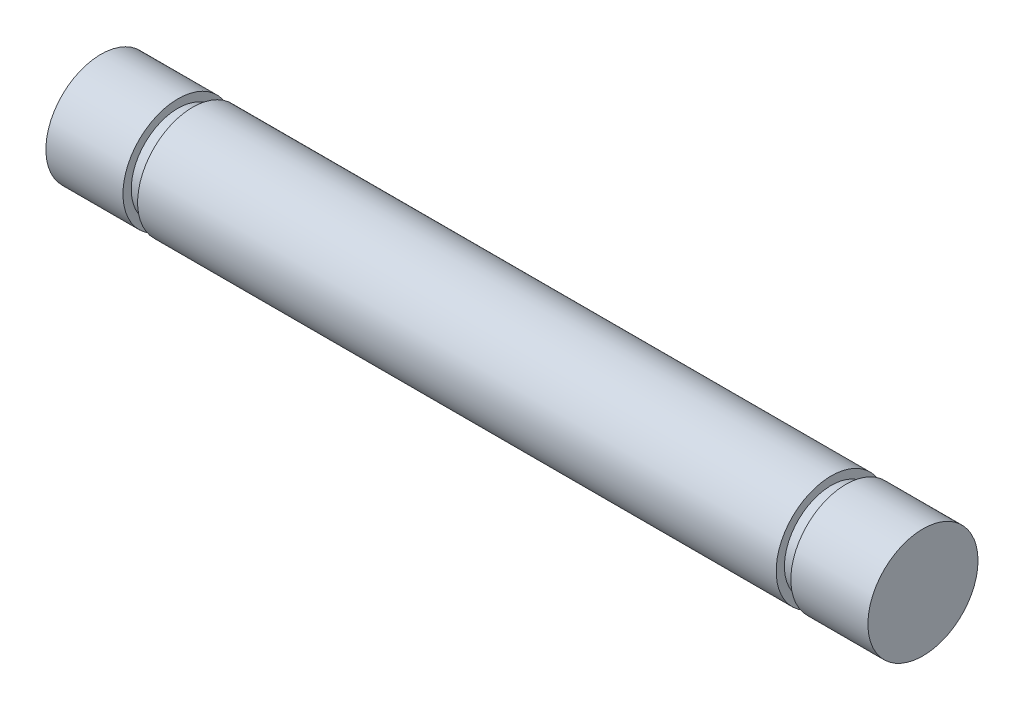
ISO-10303-21;
HEADER;
FILE_DESCRIPTION(('STEP AP214'),'2;1');
FILE_NAME('part.step','',(''),(''),'','','');
FILE_SCHEMA(('AUTOMOTIVE_DESIGN { 1 0 10303 214 1 1 1 1 }'));
ENDSEC;
DATA;
#1=APPLICATION_CONTEXT('core data for automotive mechanical design processes');
#2=APPLICATION_PROTOCOL_DEFINITION('international standard','automotive_design',2000,#1);
#3=PRODUCT_CONTEXT('',#1,'mechanical');
#4=PRODUCT('Part','Part','',(#3));
#5=PRODUCT_RELATED_PRODUCT_CATEGORY('part','',(#4));
#6=PRODUCT_DEFINITION_FORMATION('','',#4);
#7=PRODUCT_DEFINITION_CONTEXT('part definition',#1,'design');
#8=PRODUCT_DEFINITION('design','',#6,#7);
#9=PRODUCT_DEFINITION_SHAPE('','',#8);
#10=(LENGTH_UNIT() NAMED_UNIT(*) SI_UNIT(.MILLI.,.METRE.));
#11=(NAMED_UNIT(*) PLANE_ANGLE_UNIT() SI_UNIT($,.RADIAN.));
#12=(NAMED_UNIT(*) SI_UNIT($,.STERADIAN.) SOLID_ANGLE_UNIT());
#13=UNCERTAINTY_MEASURE_WITH_UNIT(LENGTH_MEASURE(1.E-05),#10,'distance_accuracy_value','');
#14=(GEOMETRIC_REPRESENTATION_CONTEXT(3) GLOBAL_UNCERTAINTY_ASSIGNED_CONTEXT((#13)) GLOBAL_UNIT_ASSIGNED_CONTEXT((#10,
#11,#12)) REPRESENTATION_CONTEXT('',''));
#15=CARTESIAN_POINT('',(0.,0.,0.));
#16=DIRECTION('',(0.,0.,1.));
#17=DIRECTION('',(1.,0.,0.));
#18=AXIS2_PLACEMENT_3D('',#15,#16,#17);
#19=CARTESIAN_POINT('',(22.4,0.,3.));
#20=DIRECTION('',(-1.,0.,0.));
#21=DIRECTION('',(0.,0.,1.));
#22=AXIS2_PLACEMENT_3D('',#19,#20,#21);
#23=PLANE('',#22);
#24=CARTESIAN_POINT('',(22.4,0.,0.));
#25=DIRECTION('',(1.,0.,0.));
#26=DIRECTION('',(0.,0.,-1.));
#27=AXIS2_PLACEMENT_3D('',#24,#25,#26);
#28=CIRCLE('',#27,3.);
#29=CARTESIAN_POINT('',(22.4,0.,-3.));
#30=VERTEX_POINT('',#29);
#31=EDGE_CURVE('E75',#30,#30,#28,.T.);
#32=ORIENTED_EDGE('',*,*,#31,.T.);
#33=EDGE_LOOP('',(#32));
#34=FACE_BOUND('',#33,.T.);
#35=ADVANCED_FACE('F41',(#34),#23,.F.);
#36=CARTESIAN_POINT('',(-22.4,0.,3.));
#37=DIRECTION('',(1.,0.,0.));
#38=DIRECTION('',(0.,0.,-1.));
#39=AXIS2_PLACEMENT_3D('',#36,#37,#38);
#40=PLANE('',#39);
#41=CARTESIAN_POINT('',(-22.4,0.,0.));
#42=DIRECTION('',(1.,0.,0.));
#43=DIRECTION('',(0.,0.,-1.));
#44=AXIS2_PLACEMENT_3D('',#41,#42,#43);
#45=CIRCLE('',#44,3.);
#46=CARTESIAN_POINT('',(-22.4,0.,-3.));
#47=VERTEX_POINT('',#46);
#48=EDGE_CURVE('E10',#47,#47,#45,.T.);
#49=ORIENTED_EDGE('',*,*,#48,.F.);
#50=EDGE_LOOP('',(#49));
#51=FACE_BOUND('',#50,.T.);
#52=ADVANCED_FACE('F129',(#51),#40,.F.);
#53=CARTESIAN_POINT('',(22.4,0.,0.));
#54=DIRECTION('',(1.,0.,0.));
#55=DIRECTION('',(0.,0.,-1.));
#56=AXIS2_PLACEMENT_3D('',#53,#54,#55);
#57=CYLINDRICAL_SURFACE('',#56,3.);
#58=CARTESIAN_POINT('',(-18.2,0.,0.));
#59=DIRECTION('',(1.,0.,0.));
#60=DIRECTION('',(0.,0.,-1.));
#61=AXIS2_PLACEMENT_3D('',#58,#59,#60);
#62=CIRCLE('',#61,3.);
#63=CARTESIAN_POINT('',(-18.2,0.,-3.));
#64=VERTEX_POINT('',#63);
#65=EDGE_CURVE('E47',#64,#64,#62,.T.);
#66=ORIENTED_EDGE('',*,*,#65,.F.);
#67=EDGE_LOOP('',(#66));
#68=FACE_BOUND('',#67,.T.);
#69=ORIENTED_EDGE('',*,*,#48,.T.);
#70=EDGE_LOOP('',(#69));
#71=FACE_BOUND('',#70,.T.);
#72=ADVANCED_FACE('F124',(#68,#71),#57,.T.);
#73=CARTESIAN_POINT('',(-18.2,0.,2.55));
#74=DIRECTION('',(-1.,0.,0.));
#75=DIRECTION('',(0.,0.,1.));
#76=AXIS2_PLACEMENT_3D('',#73,#74,#75);
#77=PLANE('',#76);
#78=CARTESIAN_POINT('',(-18.2,0.,0.));
#79=DIRECTION('',(1.,0.,0.));
#80=DIRECTION('',(0.,0.,-1.));
#81=AXIS2_PLACEMENT_3D('',#78,#79,#80);
#82=CIRCLE('',#81,2.55);
#83=CARTESIAN_POINT('',(-18.2,0.,-2.55));
#84=VERTEX_POINT('',#83);
#85=EDGE_CURVE('E51',#84,#84,#82,.T.);
#86=ORIENTED_EDGE('',*,*,#85,.F.);
#87=EDGE_LOOP('',(#86));
#88=FACE_BOUND('',#87,.T.);
#89=ORIENTED_EDGE('',*,*,#65,.T.);
#90=EDGE_LOOP('',(#89));
#91=FACE_BOUND('',#90,.T.);
#92=ADVANCED_FACE('F119',(#88,#91),#77,.F.);
#93=CARTESIAN_POINT('',(22.4,0.,0.));
#94=DIRECTION('',(1.,0.,0.));
#95=DIRECTION('',(0.,0.,-1.));
#96=AXIS2_PLACEMENT_3D('',#93,#94,#95);
#97=CYLINDRICAL_SURFACE('',#96,2.55);
#98=CARTESIAN_POINT('',(-17.4,0.,0.));
#99=DIRECTION('',(1.,0.,0.));
#100=DIRECTION('',(0.,0.,-1.));
#101=AXIS2_PLACEMENT_3D('',#98,#99,#100);
#102=CIRCLE('',#101,2.55);
#103=CARTESIAN_POINT('',(-17.4,0.,-2.55));
#104=VERTEX_POINT('',#103);
#105=EDGE_CURVE('E55',#104,#104,#102,.T.);
#106=ORIENTED_EDGE('',*,*,#105,.F.);
#107=EDGE_LOOP('',(#106));
#108=FACE_BOUND('',#107,.T.);
#109=ORIENTED_EDGE('',*,*,#85,.T.);
#110=EDGE_LOOP('',(#109));
#111=FACE_BOUND('',#110,.T.);
#112=ADVANCED_FACE('F113',(#108,#111),#97,.T.);
#113=CARTESIAN_POINT('',(-17.4,0.,3.));
#114=DIRECTION('',(1.,0.,0.));
#115=DIRECTION('',(0.,0.,-1.));
#116=AXIS2_PLACEMENT_3D('',#113,#114,#115);
#117=PLANE('',#116);
#118=CARTESIAN_POINT('',(-17.4,0.,0.));
#119=DIRECTION('',(1.,0.,0.));
#120=DIRECTION('',(0.,0.,-1.));
#121=AXIS2_PLACEMENT_3D('',#118,#119,#120);
#122=CIRCLE('',#121,3.);
#123=CARTESIAN_POINT('',(-17.4,0.,-3.));
#124=VERTEX_POINT('',#123);
#125=EDGE_CURVE('E60',#124,#124,#122,.T.);
#126=ORIENTED_EDGE('',*,*,#125,.F.);
#127=EDGE_LOOP('',(#126));
#128=FACE_BOUND('',#127,.T.);
#129=ORIENTED_EDGE('',*,*,#105,.T.);
#130=EDGE_LOOP('',(#129));
#131=FACE_BOUND('',#130,.T.);
#132=ADVANCED_FACE('F107',(#128,#131),#117,.F.);
#133=CARTESIAN_POINT('',(22.4,0.,0.));
#134=DIRECTION('',(1.,0.,0.));
#135=DIRECTION('',(0.,0.,-1.));
#136=AXIS2_PLACEMENT_3D('',#133,#134,#135);
#137=CYLINDRICAL_SURFACE('',#136,3.);
#138=CARTESIAN_POINT('',(17.4,0.,0.));
#139=DIRECTION('',(1.,0.,0.));
#140=DIRECTION('',(0.,0.,-1.));
#141=AXIS2_PLACEMENT_3D('',#138,#139,#140);
#142=CIRCLE('',#141,3.);
#143=CARTESIAN_POINT('',(17.4,0.,-3.));
#144=VERTEX_POINT('',#143);
#145=EDGE_CURVE('E63',#144,#144,#142,.T.);
#146=ORIENTED_EDGE('',*,*,#145,.F.);
#147=EDGE_LOOP('',(#146));
#148=FACE_BOUND('',#147,.T.);
#149=ORIENTED_EDGE('',*,*,#125,.T.);
#150=EDGE_LOOP('',(#149));
#151=FACE_BOUND('',#150,.T.);
#152=ADVANCED_FACE('F101',(#148,#151),#137,.T.);
#153=CARTESIAN_POINT('',(17.4,0.,3.));
#154=DIRECTION('',(-1.,0.,0.));
#155=DIRECTION('',(0.,0.,1.));
#156=AXIS2_PLACEMENT_3D('',#153,#154,#155);
#157=PLANE('',#156);
#158=CARTESIAN_POINT('',(17.4,0.,0.));
#159=DIRECTION('',(1.,0.,0.));
#160=DIRECTION('',(0.,0.,-1.));
#161=AXIS2_PLACEMENT_3D('',#158,#159,#160);
#162=CIRCLE('',#161,2.55);
#163=CARTESIAN_POINT('',(17.4,0.,-2.55));
#164=VERTEX_POINT('',#163);
#165=EDGE_CURVE('E66',#164,#164,#162,.T.);
#166=ORIENTED_EDGE('',*,*,#165,.F.);
#167=EDGE_LOOP('',(#166));
#168=FACE_BOUND('',#167,.T.);
#169=ORIENTED_EDGE('',*,*,#145,.T.);
#170=EDGE_LOOP('',(#169));
#171=FACE_BOUND('',#170,.T.);
#172=ADVANCED_FACE('F95',(#168,#171),#157,.F.);
#173=CARTESIAN_POINT('',(22.4,0.,0.));
#174=DIRECTION('',(1.,0.,0.));
#175=DIRECTION('',(0.,0.,-1.));
#176=AXIS2_PLACEMENT_3D('',#173,#174,#175);
#177=CYLINDRICAL_SURFACE('',#176,2.55);
#178=CARTESIAN_POINT('',(18.2,0.,0.));
#179=DIRECTION('',(1.,0.,0.));
#180=DIRECTION('',(0.,0.,-1.));
#181=AXIS2_PLACEMENT_3D('',#178,#179,#180);
#182=CIRCLE('',#181,2.55);
#183=CARTESIAN_POINT('',(18.2,0.,-2.55));
#184=VERTEX_POINT('',#183);
#185=EDGE_CURVE('E69',#184,#184,#182,.T.);
#186=ORIENTED_EDGE('',*,*,#185,.F.);
#187=EDGE_LOOP('',(#186));
#188=FACE_BOUND('',#187,.T.);
#189=ORIENTED_EDGE('',*,*,#165,.T.);
#190=EDGE_LOOP('',(#189));
#191=FACE_BOUND('',#190,.T.);
#192=ADVANCED_FACE('F89',(#188,#191),#177,.T.);
#193=CARTESIAN_POINT('',(18.2,0.,2.55));
#194=DIRECTION('',(1.,0.,0.));
#195=DIRECTION('',(0.,0.,-1.));
#196=AXIS2_PLACEMENT_3D('',#193,#194,#195);
#197=PLANE('',#196);
#198=CARTESIAN_POINT('',(18.2,0.,0.));
#199=DIRECTION('',(1.,0.,0.));
#200=DIRECTION('',(0.,0.,-1.));
#201=AXIS2_PLACEMENT_3D('',#198,#199,#200);
#202=CIRCLE('',#201,3.);
#203=CARTESIAN_POINT('',(18.2,0.,-3.));
#204=VERTEX_POINT('',#203);
#205=EDGE_CURVE('E72',#204,#204,#202,.T.);
#206=ORIENTED_EDGE('',*,*,#205,.F.);
#207=EDGE_LOOP('',(#206));
#208=FACE_BOUND('',#207,.T.);
#209=ORIENTED_EDGE('',*,*,#185,.T.);
#210=EDGE_LOOP('',(#209));
#211=FACE_BOUND('',#210,.T.);
#212=ADVANCED_FACE('F83',(#208,#211),#197,.F.);
#213=CARTESIAN_POINT('',(22.4,0.,0.));
#214=DIRECTION('',(1.,0.,0.));
#215=DIRECTION('',(0.,0.,-1.));
#216=AXIS2_PLACEMENT_3D('',#213,#214,#215);
#217=CYLINDRICAL_SURFACE('',#216,3.);
#218=ORIENTED_EDGE('',*,*,#31,.F.);
#219=EDGE_LOOP('',(#218));
#220=FACE_BOUND('',#219,.T.);
#221=ORIENTED_EDGE('',*,*,#205,.T.);
#222=EDGE_LOOP('',(#221));
#223=FACE_BOUND('',#222,.T.);
#224=ADVANCED_FACE('F80',(#220,#223),#217,.T.);
#225=CLOSED_SHELL('',(#35,#52,#72,#92,#112,#132,#152,#172,#192,#212,#224));
#226=MANIFOLD_SOLID_BREP('B2',#225);
#227=ADVANCED_BREP_SHAPE_REPRESENTATION('',(#18,#226),#14);
#228=SHAPE_DEFINITION_REPRESENTATION(#9,#227);
ENDSEC;
END-ISO-10303-21;
